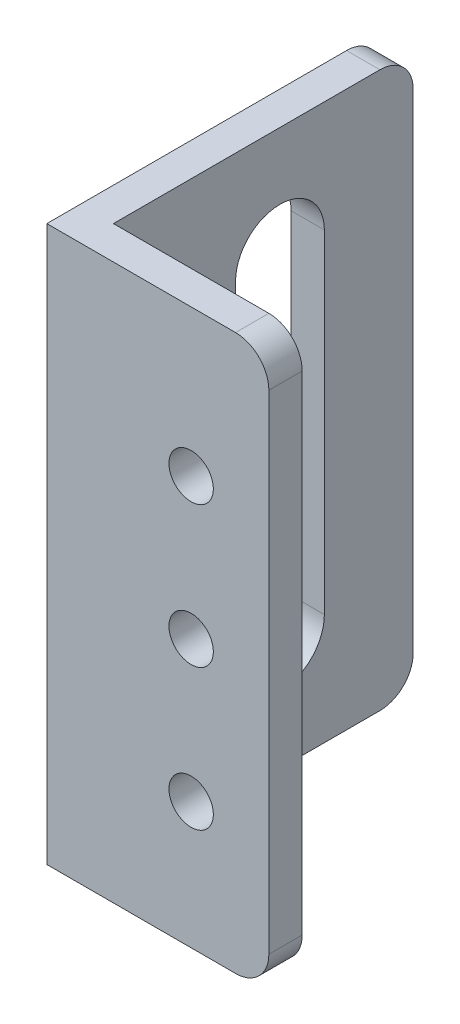
ISO-10303-21;
HEADER;
FILE_DESCRIPTION(('STEP AP214'),'2;1');
FILE_NAME('part.step','',(''),(''),'','','');
FILE_SCHEMA(('AUTOMOTIVE_DESIGN { 1 0 10303 214 1 1 1 1 }'));
ENDSEC;
DATA;
#1=APPLICATION_CONTEXT('core data for automotive mechanical design processes');
#2=APPLICATION_PROTOCOL_DEFINITION('international standard','automotive_design',2000,#1);
#3=PRODUCT_CONTEXT('',#1,'mechanical');
#4=PRODUCT('Part','Part','',(#3));
#5=PRODUCT_RELATED_PRODUCT_CATEGORY('part','',(#4));
#6=PRODUCT_DEFINITION_FORMATION('','',#4);
#7=PRODUCT_DEFINITION_CONTEXT('part definition',#1,'design');
#8=PRODUCT_DEFINITION('design','',#6,#7);
#9=PRODUCT_DEFINITION_SHAPE('','',#8);
#10=(LENGTH_UNIT() NAMED_UNIT(*) SI_UNIT(.MILLI.,.METRE.));
#11=(NAMED_UNIT(*) PLANE_ANGLE_UNIT() SI_UNIT($,.RADIAN.));
#12=(NAMED_UNIT(*) SI_UNIT($,.STERADIAN.) SOLID_ANGLE_UNIT());
#13=UNCERTAINTY_MEASURE_WITH_UNIT(LENGTH_MEASURE(1.E-05),#10,'distance_accuracy_value','');
#14=(GEOMETRIC_REPRESENTATION_CONTEXT(3) GLOBAL_UNCERTAINTY_ASSIGNED_CONTEXT((#13)) GLOBAL_UNIT_ASSIGNED_CONTEXT((#10,
#11,#12)) REPRESENTATION_CONTEXT('',''));
#15=CARTESIAN_POINT('',(0.,0.,0.));
#16=DIRECTION('',(0.,0.,1.));
#17=DIRECTION('',(1.,0.,0.));
#18=AXIS2_PLACEMENT_3D('',#15,#16,#17);
#19=CARTESIAN_POINT('',(-1.5,50.,0.));
#20=DIRECTION('',(1.,0.,0.));
#21=DIRECTION('',(0.,0.,-1.));
#22=AXIS2_PLACEMENT_3D('',#19,#20,#21);
#23=PLANE('',#22);
#24=DIRECTION('',(0.,-1.,0.));
#25=VECTOR('',#24,1.);
#26=CARTESIAN_POINT('',(-1.5,40.,-7.));
#27=LINE('',#26,#25);
#28=CARTESIAN_POINT('',(-1.5,40.,-7.));
#29=VERTEX_POINT('',#28);
#30=CARTESIAN_POINT('',(-1.5,10.,-7.));
#31=VERTEX_POINT('',#30);
#32=EDGE_CURVE('E158',#29,#31,#27,.T.);
#33=ORIENTED_EDGE('',*,*,#32,.F.);
#34=CARTESIAN_POINT('',(-1.5,40.,-3.));
#35=DIRECTION('',(-1.,0.,0.));
#36=DIRECTION('',(0.,0.,1.));
#37=AXIS2_PLACEMENT_3D('',#34,#35,#36);
#38=CIRCLE('',#37,4.);
#39=CARTESIAN_POINT('',(-1.5,40.,1.));
#40=VERTEX_POINT('',#39);
#41=EDGE_CURVE('E163',#40,#29,#38,.T.);
#42=ORIENTED_EDGE('',*,*,#41,.F.);
#43=DIRECTION('',(0.,1.,0.));
#44=VECTOR('',#43,1.);
#45=CARTESIAN_POINT('',(-1.5,40.,1.));
#46=LINE('',#45,#44);
#47=CARTESIAN_POINT('',(-1.5,10.,1.));
#48=VERTEX_POINT('',#47);
#49=EDGE_CURVE('E167',#48,#40,#46,.T.);
#50=ORIENTED_EDGE('',*,*,#49,.F.);
#51=CARTESIAN_POINT('',(-1.5,10.,-3.));
#52=DIRECTION('',(-1.,0.,0.));
#53=DIRECTION('',(0.,0.,1.));
#54=AXIS2_PLACEMENT_3D('',#51,#52,#53);
#55=CIRCLE('',#54,4.);
#56=EDGE_CURVE('E147',#31,#48,#55,.T.);
#57=ORIENTED_EDGE('',*,*,#56,.F.);
#58=EDGE_LOOP('',(#33,#42,#50,#57));
#59=FACE_BOUND('',#58,.T.);
#60=DIRECTION('',(0.,-1.,0.));
#61=VECTOR('',#60,1.);
#62=CARTESIAN_POINT('',(-1.5,50.,-15.));
#63=LINE('',#62,#61);
#64=CARTESIAN_POINT('',(-1.5,47.,-15.));
#65=VERTEX_POINT('',#64);
#66=CARTESIAN_POINT('',(-1.5,3.,-15.));
#67=VERTEX_POINT('',#66);
#68=EDGE_CURVE('E197',#65,#67,#63,.T.);
#69=ORIENTED_EDGE('',*,*,#68,.T.);
#70=CARTESIAN_POINT('',(-1.5,3.,-12.));
#71=DIRECTION('',(1.,0.,0.));
#72=DIRECTION('',(0.,0.,-1.));
#73=AXIS2_PLACEMENT_3D('',#70,#71,#72);
#74=CIRCLE('',#73,3.);
#75=CARTESIAN_POINT('',(-1.5,0.,-12.));
#76=VERTEX_POINT('',#75);
#77=EDGE_CURVE('E253',#67,#76,#74,.F.);
#78=ORIENTED_EDGE('',*,*,#77,.T.);
#79=DIRECTION('',(0.,0.,1.));
#80=VECTOR('',#79,1.);
#81=CARTESIAN_POINT('',(-1.5,0.,0.));
#82=LINE('',#81,#80);
#83=CARTESIAN_POINT('',(-1.5,0.,15.));
#84=VERTEX_POINT('',#83);
#85=EDGE_CURVE('E198',#76,#84,#82,.T.);
#86=ORIENTED_EDGE('',*,*,#85,.T.);
#87=DIRECTION('',(0.,-1.,0.));
#88=VECTOR('',#87,1.);
#89=CARTESIAN_POINT('',(-1.5,50.,15.));
#90=LINE('',#89,#88);
#91=CARTESIAN_POINT('',(-1.5,50.,15.));
#92=VERTEX_POINT('',#91);
#93=EDGE_CURVE('E220',#92,#84,#90,.T.);
#94=ORIENTED_EDGE('',*,*,#93,.F.);
#95=DIRECTION('',(0.,0.,1.));
#96=VECTOR('',#95,1.);
#97=CARTESIAN_POINT('',(-1.5,50.,0.));
#98=LINE('',#97,#96);
#99=CARTESIAN_POINT('',(-1.5,50.,-12.));
#100=VERTEX_POINT('',#99);
#101=EDGE_CURVE('E186',#100,#92,#98,.T.);
#102=ORIENTED_EDGE('',*,*,#101,.F.);
#103=CARTESIAN_POINT('',(-1.5,47.,-12.));
#104=DIRECTION('',(1.,0.,0.));
#105=DIRECTION('',(0.,0.,-1.));
#106=AXIS2_PLACEMENT_3D('',#103,#104,#105);
#107=CIRCLE('',#106,3.);
#108=EDGE_CURVE('E251',#100,#65,#107,.F.);
#109=ORIENTED_EDGE('',*,*,#108,.T.);
#110=EDGE_LOOP('',(#69,#78,#86,#94,#102,#109));
#111=FACE_BOUND('',#110,.T.);
#112=ADVANCED_FACE('F41',(#59,#111),#23,.F.);
#113=CARTESIAN_POINT('',(0.,50.,15.));
#114=DIRECTION('',(0.,0.,-1.));
#115=DIRECTION('',(-1.,0.,0.));
#116=AXIS2_PLACEMENT_3D('',#113,#114,#115);
#117=PLANE('',#116);
#118=CARTESIAN_POINT('',(11.5,36.8,15.));
#119=DIRECTION('',(0.,0.,1.));
#120=DIRECTION('',(1.,0.,0.));
#121=AXIS2_PLACEMENT_3D('',#118,#119,#120);
#122=CIRCLE('',#121,2.);
#123=CARTESIAN_POINT('',(13.5,36.8,15.));
#124=VERTEX_POINT('',#123);
#125=EDGE_CURVE('E177',#124,#124,#122,.T.);
#126=ORIENTED_EDGE('',*,*,#125,.F.);
#127=EDGE_LOOP('',(#126));
#128=FACE_BOUND('',#127,.T.);
#129=CARTESIAN_POINT('',(11.5000000000001,24.1,15.));
#130=DIRECTION('',(0.,0.,1.));
#131=DIRECTION('',(1.,0.,0.));
#132=AXIS2_PLACEMENT_3D('',#129,#130,#131);
#133=CIRCLE('',#132,2.);
#134=CARTESIAN_POINT('',(13.5000000000001,24.1,15.));
#135=VERTEX_POINT('',#134);
#136=EDGE_CURVE('E181',#135,#135,#133,.T.);
#137=ORIENTED_EDGE('',*,*,#136,.F.);
#138=EDGE_LOOP('',(#137));
#139=FACE_BOUND('',#138,.T.);
#140=CARTESIAN_POINT('',(11.5000000000003,11.4,15.));
#141=DIRECTION('',(0.,0.,1.));
#142=DIRECTION('',(1.,0.,0.));
#143=AXIS2_PLACEMENT_3D('',#140,#141,#142);
#144=CIRCLE('',#143,2.);
#145=CARTESIAN_POINT('',(13.5000000000003,11.4,15.));
#146=VERTEX_POINT('',#145);
#147=EDGE_CURVE('E174',#146,#146,#144,.T.);
#148=ORIENTED_EDGE('',*,*,#147,.F.);
#149=EDGE_LOOP('',(#148));
#150=FACE_BOUND('',#149,.T.);
#151=DIRECTION('',(0.,-1.,0.));
#152=VECTOR('',#151,1.);
#153=CARTESIAN_POINT('',(18.5,50.,15.));
#154=LINE('',#153,#152);
#155=CARTESIAN_POINT('',(18.5,47.,15.));
#156=VERTEX_POINT('',#155);
#157=CARTESIAN_POINT('',(18.5,3.,15.));
#158=VERTEX_POINT('',#157);
#159=EDGE_CURVE('E218',#156,#158,#154,.T.);
#160=ORIENTED_EDGE('',*,*,#159,.F.);
#161=CARTESIAN_POINT('',(15.5,47.,15.));
#162=DIRECTION('',(0.,0.,-1.));
#163=DIRECTION('',(-1.,0.,0.));
#164=AXIS2_PLACEMENT_3D('',#161,#162,#163);
#165=CIRCLE('',#164,3.);
#166=CARTESIAN_POINT('',(15.5,50.,15.));
#167=VERTEX_POINT('',#166);
#168=EDGE_CURVE('E11',#156,#167,#165,.F.);
#169=ORIENTED_EDGE('',*,*,#168,.T.);
#170=DIRECTION('',(1.,0.,0.));
#171=VECTOR('',#170,1.);
#172=CARTESIAN_POINT('',(0.,50.,15.));
#173=LINE('',#172,#171);
#174=EDGE_CURVE('E188',#92,#167,#173,.T.);
#175=ORIENTED_EDGE('',*,*,#174,.F.);
#176=ORIENTED_EDGE('',*,*,#93,.T.);
#177=DIRECTION('',(1.,0.,0.));
#178=VECTOR('',#177,1.);
#179=CARTESIAN_POINT('',(0.,0.,15.));
#180=LINE('',#179,#178);
#181=CARTESIAN_POINT('',(15.5,0.,15.));
#182=VERTEX_POINT('',#181);
#183=EDGE_CURVE('E200',#84,#182,#180,.T.);
#184=ORIENTED_EDGE('',*,*,#183,.T.);
#185=CARTESIAN_POINT('',(15.5,3.,15.));
#186=DIRECTION('',(0.,0.,-1.));
#187=DIRECTION('',(-1.,0.,0.));
#188=AXIS2_PLACEMENT_3D('',#185,#186,#187);
#189=CIRCLE('',#188,3.);
#190=EDGE_CURVE('E49',#182,#158,#189,.F.);
#191=ORIENTED_EDGE('',*,*,#190,.T.);
#192=EDGE_LOOP('',(#160,#169,#175,#176,#184,#191));
#193=FACE_BOUND('',#192,.T.);
#194=ADVANCED_FACE('F285',(#128,#139,#150,#193),#117,.F.);
#195=CARTESIAN_POINT('',(18.5,50.,0.));
#196=DIRECTION('',(-1.,0.,0.));
#197=DIRECTION('',(0.,0.,1.));
#198=AXIS2_PLACEMENT_3D('',#195,#196,#197);
#199=PLANE('',#198);
#200=DIRECTION('',(0.,-1.,0.));
#201=VECTOR('',#200,1.);
#202=CARTESIAN_POINT('',(18.5,50.,12.));
#203=LINE('',#202,#201);
#204=CARTESIAN_POINT('',(18.5,47.,12.));
#205=VERTEX_POINT('',#204);
#206=CARTESIAN_POINT('',(18.5,3.,12.));
#207=VERTEX_POINT('',#206);
#208=EDGE_CURVE('E215',#205,#207,#203,.T.);
#209=ORIENTED_EDGE('',*,*,#208,.F.);
#210=DIRECTION('',(0.,0.,-1.));
#211=VECTOR('',#210,1.);
#212=CARTESIAN_POINT('',(18.5,47.,15.));
#213=LINE('',#212,#211);
#214=EDGE_CURVE('E62',#205,#156,#213,.F.);
#215=ORIENTED_EDGE('',*,*,#214,.T.);
#216=ORIENTED_EDGE('',*,*,#159,.T.);
#217=DIRECTION('',(0.,0.,-1.));
#218=VECTOR('',#217,1.);
#219=CARTESIAN_POINT('',(18.5,3.,0.));
#220=LINE('',#219,#218);
#221=EDGE_CURVE('E264',#158,#207,#220,.T.);
#222=ORIENTED_EDGE('',*,*,#221,.T.);
#223=EDGE_LOOP('',(#209,#215,#216,#222));
#224=FACE_BOUND('',#223,.T.);
#225=ADVANCED_FACE('F268',(#224),#199,.F.);
#226=CARTESIAN_POINT('',(0.,50.,12.));
#227=DIRECTION('',(0.,0.,-1.));
#228=DIRECTION('',(-1.,0.,0.));
#229=AXIS2_PLACEMENT_3D('',#226,#227,#228);
#230=PLANE('',#229);
#231=CARTESIAN_POINT('',(11.5,36.8,12.));
#232=DIRECTION('',(0.,0.,-1.));
#233=DIRECTION('',(-1.,0.,0.));
#234=AXIS2_PLACEMENT_3D('',#231,#232,#233);
#235=CIRCLE('',#234,2.);
#236=CARTESIAN_POINT('',(9.50000000000001,36.8,12.));
#237=VERTEX_POINT('',#236);
#238=EDGE_CURVE('E201',#237,#237,#235,.T.);
#239=ORIENTED_EDGE('',*,*,#238,.F.);
#240=EDGE_LOOP('',(#239));
#241=FACE_BOUND('',#240,.T.);
#242=CARTESIAN_POINT('',(11.5000000000001,24.1,12.));
#243=DIRECTION('',(0.,0.,-1.));
#244=DIRECTION('',(-1.,0.,0.));
#245=AXIS2_PLACEMENT_3D('',#242,#243,#244);
#246=CIRCLE('',#245,2.);
#247=CARTESIAN_POINT('',(9.50000000000014,24.1,12.));
#248=VERTEX_POINT('',#247);
#249=EDGE_CURVE('E226',#248,#248,#246,.T.);
#250=ORIENTED_EDGE('',*,*,#249,.F.);
#251=EDGE_LOOP('',(#250));
#252=FACE_BOUND('',#251,.T.);
#253=CARTESIAN_POINT('',(11.5000000000003,11.4,12.));
#254=DIRECTION('',(0.,0.,-1.));
#255=DIRECTION('',(-1.,0.,0.));
#256=AXIS2_PLACEMENT_3D('',#253,#254,#255);
#257=CIRCLE('',#256,2.);
#258=CARTESIAN_POINT('',(9.50000000000027,11.4,12.));
#259=VERTEX_POINT('',#258);
#260=EDGE_CURVE('E180',#259,#259,#257,.T.);
#261=ORIENTED_EDGE('',*,*,#260,.F.);
#262=EDGE_LOOP('',(#261));
#263=FACE_BOUND('',#262,.T.);
#264=DIRECTION('',(1.,0.,0.));
#265=VECTOR('',#264,1.);
#266=CARTESIAN_POINT('',(0.,50.,12.));
#267=LINE('',#266,#265);
#268=CARTESIAN_POINT('',(1.5,50.,12.));
#269=VERTEX_POINT('',#268);
#270=CARTESIAN_POINT('',(15.5,50.,12.));
#271=VERTEX_POINT('',#270);
#272=EDGE_CURVE('E192',#269,#271,#267,.T.);
#273=ORIENTED_EDGE('',*,*,#272,.T.);
#274=CARTESIAN_POINT('',(15.5,47.,12.));
#275=DIRECTION('',(0.,0.,-1.));
#276=DIRECTION('',(-1.,0.,0.));
#277=AXIS2_PLACEMENT_3D('',#274,#275,#276);
#278=CIRCLE('',#277,3.);
#279=EDGE_CURVE('E262',#271,#205,#278,.T.);
#280=ORIENTED_EDGE('',*,*,#279,.T.);
#281=ORIENTED_EDGE('',*,*,#208,.T.);
#282=CARTESIAN_POINT('',(15.5,3.,12.));
#283=DIRECTION('',(0.,0.,-1.));
#284=DIRECTION('',(-1.,0.,0.));
#285=AXIS2_PLACEMENT_3D('',#282,#283,#284);
#286=CIRCLE('',#285,3.);
#287=CARTESIAN_POINT('',(15.5,0.,12.));
#288=VERTEX_POINT('',#287);
#289=EDGE_CURVE('E260',#207,#288,#286,.T.);
#290=ORIENTED_EDGE('',*,*,#289,.T.);
#291=DIRECTION('',(1.,0.,0.));
#292=VECTOR('',#291,1.);
#293=CARTESIAN_POINT('',(0.,0.,12.));
#294=LINE('',#293,#292);
#295=CARTESIAN_POINT('',(1.5,0.,12.));
#296=VERTEX_POINT('',#295);
#297=EDGE_CURVE('E203',#296,#288,#294,.T.);
#298=ORIENTED_EDGE('',*,*,#297,.F.);
#299=DIRECTION('',(0.,-1.,0.));
#300=VECTOR('',#299,1.);
#301=CARTESIAN_POINT('',(1.5,50.,12.));
#302=LINE('',#301,#300);
#303=EDGE_CURVE('E212',#269,#296,#302,.T.);
#304=ORIENTED_EDGE('',*,*,#303,.F.);
#305=EDGE_LOOP('',(#273,#280,#281,#290,#298,#304));
#306=FACE_BOUND('',#305,.T.);
#307=ADVANCED_FACE('F271',(#241,#252,#263,#306),#230,.T.);
#308=CARTESIAN_POINT('',(1.5,50.,0.));
#309=DIRECTION('',(1.,0.,0.));
#310=DIRECTION('',(0.,0.,-1.));
#311=AXIS2_PLACEMENT_3D('',#308,#309,#310);
#312=PLANE('',#311);
#313=CARTESIAN_POINT('',(1.5,40.,-3.));
#314=DIRECTION('',(1.,0.,0.));
#315=DIRECTION('',(0.,0.,-1.));
#316=AXIS2_PLACEMENT_3D('',#313,#314,#315);
#317=CIRCLE('',#316,4.);
#318=CARTESIAN_POINT('',(1.5,40.,-7.));
#319=VERTEX_POINT('',#318);
#320=CARTESIAN_POINT('',(1.5,40.,1.));
#321=VERTEX_POINT('',#320);
#322=EDGE_CURVE('E235',#319,#321,#317,.T.);
#323=ORIENTED_EDGE('',*,*,#322,.F.);
#324=DIRECTION('',(0.,1.,0.));
#325=VECTOR('',#324,1.);
#326=CARTESIAN_POINT('',(1.5,50.,-7.));
#327=LINE('',#326,#325);
#328=CARTESIAN_POINT('',(1.5,10.,-7.));
#329=VERTEX_POINT('',#328);
#330=EDGE_CURVE('E223',#329,#319,#327,.T.);
#331=ORIENTED_EDGE('',*,*,#330,.F.);
#332=CARTESIAN_POINT('',(1.5,10.,-3.));
#333=DIRECTION('',(1.,0.,0.));
#334=DIRECTION('',(0.,0.,-1.));
#335=AXIS2_PLACEMENT_3D('',#332,#333,#334);
#336=CIRCLE('',#335,4.);
#337=CARTESIAN_POINT('',(1.5,10.,1.));
#338=VERTEX_POINT('',#337);
#339=EDGE_CURVE('E150',#338,#329,#336,.T.);
#340=ORIENTED_EDGE('',*,*,#339,.F.);
#341=DIRECTION('',(0.,-1.,0.));
#342=VECTOR('',#341,1.);
#343=CARTESIAN_POINT('',(1.5,50.,1.));
#344=LINE('',#343,#342);
#345=EDGE_CURVE('E233',#321,#338,#344,.T.);
#346=ORIENTED_EDGE('',*,*,#345,.F.);
#347=EDGE_LOOP('',(#323,#331,#340,#346));
#348=FACE_BOUND('',#347,.T.);
#349=DIRECTION('',(0.,0.,1.));
#350=VECTOR('',#349,1.);
#351=CARTESIAN_POINT('',(1.5,0.,0.));
#352=LINE('',#351,#350);
#353=CARTESIAN_POINT('',(1.5,0.,-12.));
#354=VERTEX_POINT('',#353);
#355=EDGE_CURVE('E189',#354,#296,#352,.T.);
#356=ORIENTED_EDGE('',*,*,#355,.F.);
#357=CARTESIAN_POINT('',(1.5,3.,-12.));
#358=DIRECTION('',(1.,0.,0.));
#359=DIRECTION('',(0.,0.,-1.));
#360=AXIS2_PLACEMENT_3D('',#357,#358,#359);
#361=CIRCLE('',#360,3.);
#362=CARTESIAN_POINT('',(1.5,3.,-15.));
#363=VERTEX_POINT('',#362);
#364=EDGE_CURVE('E244',#354,#363,#361,.T.);
#365=ORIENTED_EDGE('',*,*,#364,.T.);
#366=DIRECTION('',(0.,-1.,0.));
#367=VECTOR('',#366,1.);
#368=CARTESIAN_POINT('',(1.5,50.,-15.));
#369=LINE('',#368,#367);
#370=CARTESIAN_POINT('',(1.5,47.,-15.));
#371=VERTEX_POINT('',#370);
#372=EDGE_CURVE('E209',#371,#363,#369,.T.);
#373=ORIENTED_EDGE('',*,*,#372,.F.);
#374=CARTESIAN_POINT('',(1.5,47.,-12.));
#375=DIRECTION('',(1.,0.,0.));
#376=DIRECTION('',(0.,0.,-1.));
#377=AXIS2_PLACEMENT_3D('',#374,#375,#376);
#378=CIRCLE('',#377,3.);
#379=CARTESIAN_POINT('',(1.5,50.,-12.));
#380=VERTEX_POINT('',#379);
#381=EDGE_CURVE('E242',#371,#380,#378,.T.);
#382=ORIENTED_EDGE('',*,*,#381,.T.);
#383=DIRECTION('',(0.,0.,1.));
#384=VECTOR('',#383,1.);
#385=CARTESIAN_POINT('',(1.5,50.,0.));
#386=LINE('',#385,#384);
#387=EDGE_CURVE('E195',#380,#269,#386,.T.);
#388=ORIENTED_EDGE('',*,*,#387,.T.);
#389=ORIENTED_EDGE('',*,*,#303,.T.);
#390=EDGE_LOOP('',(#356,#365,#373,#382,#388,#389));
#391=FACE_BOUND('',#390,.T.);
#392=ADVANCED_FACE('F326',(#348,#391),#312,.T.);
#393=CARTESIAN_POINT('',(0.,50.,-15.));
#394=DIRECTION('',(0.,0.,-1.));
#395=DIRECTION('',(-1.,0.,0.));
#396=AXIS2_PLACEMENT_3D('',#393,#394,#395);
#397=PLANE('',#396);
#398=ORIENTED_EDGE('',*,*,#372,.T.);
#399=DIRECTION('',(1.,0.,0.));
#400=VECTOR('',#399,1.);
#401=CARTESIAN_POINT('',(-1.5,3.,-15.));
#402=LINE('',#401,#400);
#403=EDGE_CURVE('E249',#363,#67,#402,.F.);
#404=ORIENTED_EDGE('',*,*,#403,.T.);
#405=ORIENTED_EDGE('',*,*,#68,.F.);
#406=DIRECTION('',(1.,0.,0.));
#407=VECTOR('',#406,1.);
#408=CARTESIAN_POINT('',(0.,47.,-15.));
#409=LINE('',#408,#407);
#410=EDGE_CURVE('E246',#65,#371,#409,.T.);
#411=ORIENTED_EDGE('',*,*,#410,.T.);
#412=EDGE_LOOP('',(#398,#404,#405,#411));
#413=FACE_BOUND('',#412,.T.);
#414=ADVANCED_FACE('F321',(#413),#397,.T.);
#415=CARTESIAN_POINT('',(0.,50.,0.));
#416=DIRECTION('',(0.,1.,0.));
#417=DIRECTION('',(0.,0.,1.));
#418=AXIS2_PLACEMENT_3D('',#415,#416,#417);
#419=PLANE('',#418);
#420=ORIENTED_EDGE('',*,*,#387,.F.);
#421=DIRECTION('',(1.,0.,0.));
#422=VECTOR('',#421,1.);
#423=CARTESIAN_POINT('',(0.,50.,-12.));
#424=LINE('',#423,#422);
#425=EDGE_CURVE('E258',#380,#100,#424,.F.);
#426=ORIENTED_EDGE('',*,*,#425,.T.);
#427=ORIENTED_EDGE('',*,*,#101,.T.);
#428=ORIENTED_EDGE('',*,*,#174,.T.);
#429=DIRECTION('',(0.,0.,-1.));
#430=VECTOR('',#429,1.);
#431=CARTESIAN_POINT('',(15.5,50.,12.));
#432=LINE('',#431,#430);
#433=EDGE_CURVE('E255',#167,#271,#432,.T.);
#434=ORIENTED_EDGE('',*,*,#433,.T.);
#435=ORIENTED_EDGE('',*,*,#272,.F.);
#436=EDGE_LOOP('',(#420,#426,#427,#428,#434,#435));
#437=FACE_BOUND('',#436,.T.);
#438=ADVANCED_FACE('F281',(#437),#419,.T.);
#439=CARTESIAN_POINT('',(0.,0.,0.));
#440=DIRECTION('',(0.,1.,0.));
#441=DIRECTION('',(0.,0.,1.));
#442=AXIS2_PLACEMENT_3D('',#439,#440,#441);
#443=PLANE('',#442);
#444=ORIENTED_EDGE('',*,*,#85,.F.);
#445=DIRECTION('',(1.,0.,0.));
#446=VECTOR('',#445,1.);
#447=CARTESIAN_POINT('',(1.5,0.,-12.));
#448=LINE('',#447,#446);
#449=EDGE_CURVE('E239',#76,#354,#448,.T.);
#450=ORIENTED_EDGE('',*,*,#449,.T.);
#451=ORIENTED_EDGE('',*,*,#355,.T.);
#452=ORIENTED_EDGE('',*,*,#297,.T.);
#453=DIRECTION('',(0.,0.,-1.));
#454=VECTOR('',#453,1.);
#455=CARTESIAN_POINT('',(15.5,0.,0.));
#456=LINE('',#455,#454);
#457=EDGE_CURVE('E237',#288,#182,#456,.F.);
#458=ORIENTED_EDGE('',*,*,#457,.T.);
#459=ORIENTED_EDGE('',*,*,#183,.F.);
#460=EDGE_LOOP('',(#444,#450,#451,#452,#458,#459));
#461=FACE_BOUND('',#460,.T.);
#462=ADVANCED_FACE('F292',(#461),#443,.F.);
#463=CARTESIAN_POINT('',(11.5000000000003,11.4,5.));
#464=DIRECTION('',(0.,0.,1.));
#465=DIRECTION('',(1.,0.,0.));
#466=AXIS2_PLACEMENT_3D('',#463,#464,#465);
#467=CYLINDRICAL_SURFACE('',#466,2.);
#468=ORIENTED_EDGE('',*,*,#260,.T.);
#469=EDGE_LOOP('',(#468));
#470=FACE_BOUND('',#469,.T.);
#471=ORIENTED_EDGE('',*,*,#147,.T.);
#472=EDGE_LOOP('',(#471));
#473=FACE_BOUND('',#472,.T.);
#474=ADVANCED_FACE('F383',(#470,#473),#467,.F.);
#475=CARTESIAN_POINT('',(11.5000000000001,24.1,5.));
#476=DIRECTION('',(0.,0.,1.));
#477=DIRECTION('',(1.,0.,0.));
#478=AXIS2_PLACEMENT_3D('',#475,#476,#477);
#479=CYLINDRICAL_SURFACE('',#478,2.);
#480=ORIENTED_EDGE('',*,*,#249,.T.);
#481=EDGE_LOOP('',(#480));
#482=FACE_BOUND('',#481,.T.);
#483=ORIENTED_EDGE('',*,*,#136,.T.);
#484=EDGE_LOOP('',(#483));
#485=FACE_BOUND('',#484,.T.);
#486=ADVANCED_FACE('F397',(#482,#485),#479,.F.);
#487=CARTESIAN_POINT('',(11.5,36.8,5.));
#488=DIRECTION('',(0.,0.,1.));
#489=DIRECTION('',(1.,0.,0.));
#490=AXIS2_PLACEMENT_3D('',#487,#488,#489);
#491=CYLINDRICAL_SURFACE('',#490,2.);
#492=ORIENTED_EDGE('',*,*,#238,.T.);
#493=EDGE_LOOP('',(#492));
#494=FACE_BOUND('',#493,.T.);
#495=ORIENTED_EDGE('',*,*,#125,.T.);
#496=EDGE_LOOP('',(#495));
#497=FACE_BOUND('',#496,.T.);
#498=ADVANCED_FACE('F407',(#494,#497),#491,.F.);
#499=CARTESIAN_POINT('',(8.5,40.,-3.));
#500=DIRECTION('',(-1.,0.,0.));
#501=DIRECTION('',(0.,0.,1.));
#502=AXIS2_PLACEMENT_3D('',#499,#500,#501);
#503=CYLINDRICAL_SURFACE('',#502,4.);
#504=ORIENTED_EDGE('',*,*,#322,.T.);
#505=DIRECTION('',(-1.,0.,0.));
#506=VECTOR('',#505,1.);
#507=CARTESIAN_POINT('',(8.5,40.,1.));
#508=LINE('',#507,#506);
#509=EDGE_CURVE('E172',#321,#40,#508,.T.);
#510=ORIENTED_EDGE('',*,*,#509,.T.);
#511=ORIENTED_EDGE('',*,*,#41,.T.);
#512=DIRECTION('',(-1.,0.,0.));
#513=VECTOR('',#512,1.);
#514=CARTESIAN_POINT('',(8.5,40.,-7.));
#515=LINE('',#514,#513);
#516=EDGE_CURVE('E154',#319,#29,#515,.T.);
#517=ORIENTED_EDGE('',*,*,#516,.F.);
#518=EDGE_LOOP('',(#504,#510,#511,#517));
#519=FACE_BOUND('',#518,.T.);
#520=ADVANCED_FACE('F417',(#519),#503,.F.);
#521=CARTESIAN_POINT('',(8.5,40.,1.));
#522=DIRECTION('',(0.,0.,1.));
#523=DIRECTION('',(1.,0.,0.));
#524=AXIS2_PLACEMENT_3D('',#521,#522,#523);
#525=PLANE('',#524);
#526=ORIENTED_EDGE('',*,*,#345,.T.);
#527=DIRECTION('',(-1.,0.,0.));
#528=VECTOR('',#527,1.);
#529=CARTESIAN_POINT('',(8.5,10.,1.));
#530=LINE('',#529,#528);
#531=EDGE_CURVE('E153',#338,#48,#530,.T.);
#532=ORIENTED_EDGE('',*,*,#531,.T.);
#533=ORIENTED_EDGE('',*,*,#49,.T.);
#534=ORIENTED_EDGE('',*,*,#509,.F.);
#535=EDGE_LOOP('',(#526,#532,#533,#534));
#536=FACE_BOUND('',#535,.T.);
#537=ADVANCED_FACE('F427',(#536),#525,.F.);
#538=CARTESIAN_POINT('',(8.5,10.,-3.));
#539=DIRECTION('',(-1.,0.,0.));
#540=DIRECTION('',(0.,0.,1.));
#541=AXIS2_PLACEMENT_3D('',#538,#539,#540);
#542=CYLINDRICAL_SURFACE('',#541,4.);
#543=ORIENTED_EDGE('',*,*,#339,.T.);
#544=DIRECTION('',(-1.,0.,0.));
#545=VECTOR('',#544,1.);
#546=CARTESIAN_POINT('',(8.5,10.,-7.));
#547=LINE('',#546,#545);
#548=EDGE_CURVE('E142',#329,#31,#547,.T.);
#549=ORIENTED_EDGE('',*,*,#548,.T.);
#550=ORIENTED_EDGE('',*,*,#56,.T.);
#551=ORIENTED_EDGE('',*,*,#531,.F.);
#552=EDGE_LOOP('',(#543,#549,#550,#551));
#553=FACE_BOUND('',#552,.T.);
#554=ADVANCED_FACE('F144',(#553),#542,.F.);
#555=CARTESIAN_POINT('',(8.5,40.,-7.));
#556=DIRECTION('',(0.,0.,-1.));
#557=DIRECTION('',(-1.,0.,0.));
#558=AXIS2_PLACEMENT_3D('',#555,#556,#557);
#559=PLANE('',#558);
#560=ORIENTED_EDGE('',*,*,#330,.T.);
#561=ORIENTED_EDGE('',*,*,#516,.T.);
#562=ORIENTED_EDGE('',*,*,#32,.T.);
#563=ORIENTED_EDGE('',*,*,#548,.F.);
#564=EDGE_LOOP('',(#560,#561,#562,#563));
#565=FACE_BOUND('',#564,.T.);
#566=ADVANCED_FACE('F159',(#565),#559,.F.);
#567=CARTESIAN_POINT('',(0.,3.,-12.));
#568=DIRECTION('',(-1.,0.,0.));
#569=DIRECTION('',(0.,0.,1.));
#570=AXIS2_PLACEMENT_3D('',#567,#568,#569);
#571=CYLINDRICAL_SURFACE('',#570,3.);
#572=ORIENTED_EDGE('',*,*,#77,.F.);
#573=ORIENTED_EDGE('',*,*,#403,.F.);
#574=ORIENTED_EDGE('',*,*,#364,.F.);
#575=ORIENTED_EDGE('',*,*,#449,.F.);
#576=EDGE_LOOP('',(#572,#573,#574,#575));
#577=FACE_BOUND('',#576,.T.);
#578=ADVANCED_FACE('F309',(#577),#571,.T.);
#579=CARTESIAN_POINT('',(0.,47.,-12.));
#580=DIRECTION('',(1.,0.,0.));
#581=DIRECTION('',(0.,0.,-1.));
#582=AXIS2_PLACEMENT_3D('',#579,#580,#581);
#583=CYLINDRICAL_SURFACE('',#582,3.);
#584=ORIENTED_EDGE('',*,*,#108,.F.);
#585=ORIENTED_EDGE('',*,*,#425,.F.);
#586=ORIENTED_EDGE('',*,*,#381,.F.);
#587=ORIENTED_EDGE('',*,*,#410,.F.);
#588=EDGE_LOOP('',(#584,#585,#586,#587));
#589=FACE_BOUND('',#588,.T.);
#590=ADVANCED_FACE('F298',(#589),#583,.T.);
#591=CARTESIAN_POINT('',(15.5,47.,0.));
#592=DIRECTION('',(0.,0.,1.));
#593=DIRECTION('',(1.,0.,0.));
#594=AXIS2_PLACEMENT_3D('',#591,#592,#593);
#595=CYLINDRICAL_SURFACE('',#594,3.);
#596=ORIENTED_EDGE('',*,*,#168,.F.);
#597=ORIENTED_EDGE('',*,*,#214,.F.);
#598=ORIENTED_EDGE('',*,*,#279,.F.);
#599=ORIENTED_EDGE('',*,*,#433,.F.);
#600=EDGE_LOOP('',(#596,#597,#598,#599));
#601=FACE_BOUND('',#600,.T.);
#602=ADVANCED_FACE('F278',(#601),#595,.T.);
#603=CARTESIAN_POINT('',(15.5,3.,0.));
#604=DIRECTION('',(0.,0.,-1.));
#605=DIRECTION('',(-1.,0.,0.));
#606=AXIS2_PLACEMENT_3D('',#603,#604,#605);
#607=CYLINDRICAL_SURFACE('',#606,3.);
#608=ORIENTED_EDGE('',*,*,#190,.F.);
#609=ORIENTED_EDGE('',*,*,#457,.F.);
#610=ORIENTED_EDGE('',*,*,#289,.F.);
#611=ORIENTED_EDGE('',*,*,#221,.F.);
#612=EDGE_LOOP('',(#608,#609,#610,#611));
#613=FACE_BOUND('',#612,.T.);
#614=ADVANCED_FACE('F43',(#613),#607,.T.);
#615=CLOSED_SHELL('',(#112,#194,#225,#307,#392,#414,#438,#462,#474,#486,#498,#520,#537,#554,
#566,#578,#590,#602,#614));
#616=MANIFOLD_SOLID_BREP('B2',#615);
#617=ADVANCED_BREP_SHAPE_REPRESENTATION('',(#18,#616),#14);
#618=SHAPE_DEFINITION_REPRESENTATION(#9,#617);
ENDSEC;
END-ISO-10303-21;
